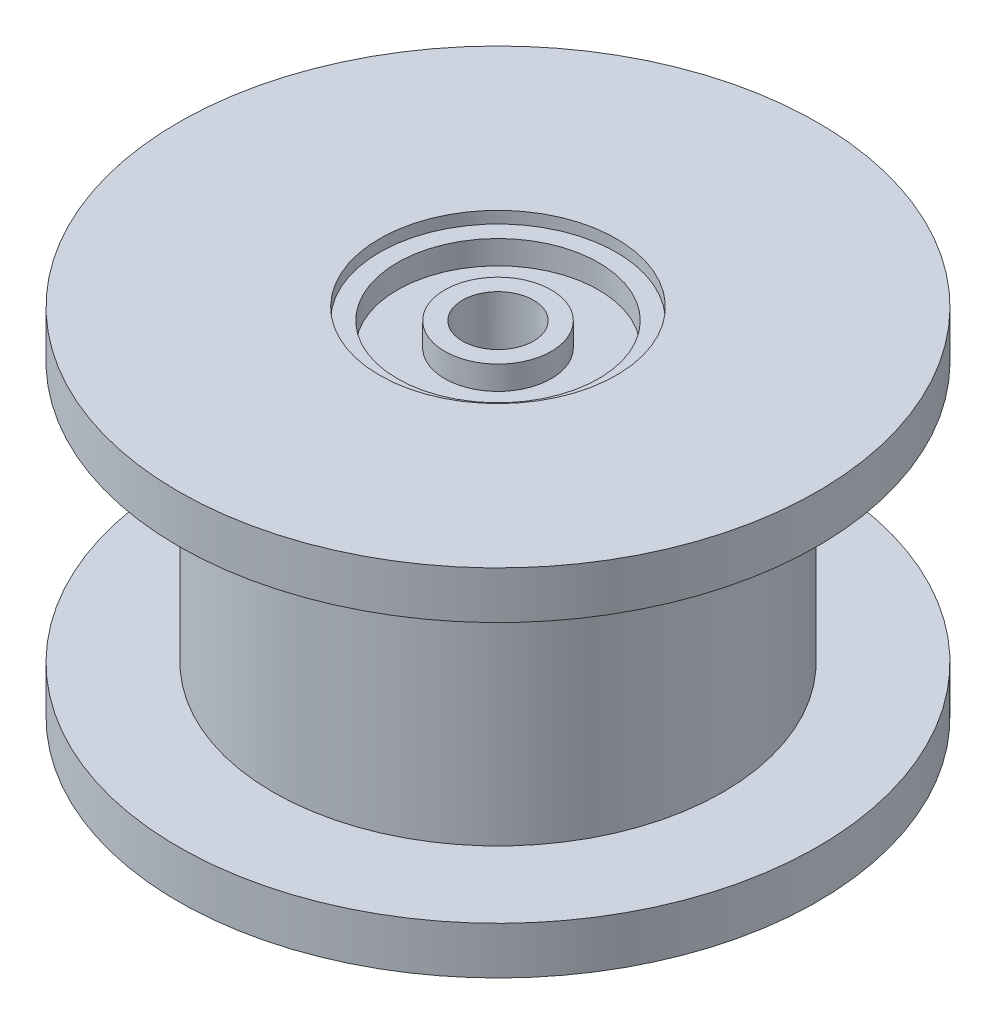
ISO-10303-21;
HEADER;
FILE_DESCRIPTION(('STEP AP214'),'2;1');
FILE_NAME('part.step','',(''),(''),'','','');
FILE_SCHEMA(('AUTOMOTIVE_DESIGN { 1 0 10303 214 1 1 1 1 }'));
ENDSEC;
DATA;
#1=APPLICATION_CONTEXT('core data for automotive mechanical design processes');
#2=APPLICATION_PROTOCOL_DEFINITION('international standard','automotive_design',2000,#1);
#3=PRODUCT_CONTEXT('',#1,'mechanical');
#4=PRODUCT('Part','Part','',(#3));
#5=PRODUCT_RELATED_PRODUCT_CATEGORY('part','',(#4));
#6=PRODUCT_DEFINITION_FORMATION('','',#4);
#7=PRODUCT_DEFINITION_CONTEXT('part definition',#1,'design');
#8=PRODUCT_DEFINITION('design','',#6,#7);
#9=PRODUCT_DEFINITION_SHAPE('','',#8);
#10=(LENGTH_UNIT() NAMED_UNIT(*) SI_UNIT(.MILLI.,.METRE.));
#11=(NAMED_UNIT(*) PLANE_ANGLE_UNIT() SI_UNIT($,.RADIAN.));
#12=(NAMED_UNIT(*) SI_UNIT($,.STERADIAN.) SOLID_ANGLE_UNIT());
#13=UNCERTAINTY_MEASURE_WITH_UNIT(LENGTH_MEASURE(1.E-05),#10,'distance_accuracy_value','');
#14=(GEOMETRIC_REPRESENTATION_CONTEXT(3) GLOBAL_UNCERTAINTY_ASSIGNED_CONTEXT((#13)) GLOBAL_UNIT_ASSIGNED_CONTEXT((#10,
#11,#12)) REPRESENTATION_CONTEXT('',''));
#15=CARTESIAN_POINT('',(0.,0.,0.));
#16=DIRECTION('',(0.,0.,1.));
#17=DIRECTION('',(1.,0.,0.));
#18=AXIS2_PLACEMENT_3D('',#15,#16,#17);
#19=CARTESIAN_POINT('',(0.,13.,0.));
#20=DIRECTION('',(0.,-1.,0.));
#21=DIRECTION('',(0.,0.,-1.));
#22=AXIS2_PLACEMENT_3D('',#19,#20,#21);
#23=CYLINDRICAL_SURFACE('',#22,1.5);
#24=CARTESIAN_POINT('',(0.,-1.5,0.));
#25=DIRECTION('',(0.,-1.,0.));
#26=DIRECTION('',(0.,0.,-1.));
#27=AXIS2_PLACEMENT_3D('',#24,#25,#26);
#28=CIRCLE('',#27,1.5);
#29=CARTESIAN_POINT('',(0.,-1.5,-1.5));
#30=VERTEX_POINT('',#29);
#31=EDGE_CURVE('E81',#30,#30,#28,.T.);
#32=ORIENTED_EDGE('',*,*,#31,.T.);
#33=EDGE_LOOP('',(#32));
#34=FACE_BOUND('',#33,.T.);
#35=CARTESIAN_POINT('',(0.,12.5,0.));
#36=DIRECTION('',(0.,1.,0.));
#37=DIRECTION('',(0.,0.,1.));
#38=AXIS2_PLACEMENT_3D('',#35,#36,#37);
#39=CIRCLE('',#38,1.5);
#40=CARTESIAN_POINT('',(0.,12.5,1.5));
#41=VERTEX_POINT('',#40);
#42=EDGE_CURVE('E102',#41,#41,#39,.F.);
#43=ORIENTED_EDGE('',*,*,#42,.F.);
#44=EDGE_LOOP('',(#43));
#45=FACE_BOUND('',#44,.T.);
#46=ADVANCED_FACE('F40',(#34,#45),#23,.F.);
#47=CARTESIAN_POINT('',(0.,11.5,0.));
#48=DIRECTION('',(0.,1.,0.));
#49=DIRECTION('',(0.,0.,1.));
#50=AXIS2_PLACEMENT_3D('',#47,#48,#49);
#51=CYLINDRICAL_SURFACE('',#50,2.25);
#52=CARTESIAN_POINT('',(0.,11.5,0.));
#53=DIRECTION('',(0.,1.,0.));
#54=DIRECTION('',(0.,0.,1.));
#55=AXIS2_PLACEMENT_3D('',#52,#53,#54);
#56=CIRCLE('',#55,2.25);
#57=CARTESIAN_POINT('',(0.,11.5,2.25));
#58=VERTEX_POINT('',#57);
#59=EDGE_CURVE('E96',#58,#58,#56,.T.);
#60=ORIENTED_EDGE('',*,*,#59,.T.);
#61=EDGE_LOOP('',(#60));
#62=FACE_BOUND('',#61,.T.);
#63=CARTESIAN_POINT('',(0.,12.5,0.));
#64=DIRECTION('',(0.,1.,0.));
#65=DIRECTION('',(0.,0.,1.));
#66=AXIS2_PLACEMENT_3D('',#63,#64,#65);
#67=CIRCLE('',#66,2.25);
#68=CARTESIAN_POINT('',(0.,12.5,2.25));
#69=VERTEX_POINT('',#68);
#70=EDGE_CURVE('E99',#69,#69,#67,.T.);
#71=ORIENTED_EDGE('',*,*,#70,.F.);
#72=EDGE_LOOP('',(#71));
#73=FACE_BOUND('',#72,.T.);
#74=ADVANCED_FACE('F110',(#62,#73),#51,.T.);
#75=CARTESIAN_POINT('',(0.,-0.5,0.));
#76=DIRECTION('',(0.,-1.,0.));
#77=DIRECTION('',(0.,0.,-1.));
#78=AXIS2_PLACEMENT_3D('',#75,#76,#77);
#79=CYLINDRICAL_SURFACE('',#78,2.25);
#80=CARTESIAN_POINT('',(0.,-0.5,0.));
#81=DIRECTION('',(0.,-1.,0.));
#82=DIRECTION('',(0.,0.,-1.));
#83=AXIS2_PLACEMENT_3D('',#80,#81,#82);
#84=CIRCLE('',#83,2.25);
#85=CARTESIAN_POINT('',(0.,-0.5,-2.25));
#86=VERTEX_POINT('',#85);
#87=EDGE_CURVE('E75',#86,#86,#84,.T.);
#88=ORIENTED_EDGE('',*,*,#87,.T.);
#89=EDGE_LOOP('',(#88));
#90=FACE_BOUND('',#89,.T.);
#91=CARTESIAN_POINT('',(0.,-1.5,0.));
#92=DIRECTION('',(0.,-1.,0.));
#93=DIRECTION('',(0.,0.,-1.));
#94=AXIS2_PLACEMENT_3D('',#91,#92,#93);
#95=CIRCLE('',#94,2.25);
#96=CARTESIAN_POINT('',(0.,-1.5,-2.25));
#97=VERTEX_POINT('',#96);
#98=EDGE_CURVE('E78',#97,#97,#95,.T.);
#99=ORIENTED_EDGE('',*,*,#98,.F.);
#100=EDGE_LOOP('',(#99));
#101=FACE_BOUND('',#100,.T.);
#102=ADVANCED_FACE('F116',(#90,#101),#79,.T.);
#103=CARTESIAN_POINT('',(0.,11.,0.));
#104=DIRECTION('',(0.,-1.,0.));
#105=DIRECTION('',(0.,0.,-1.));
#106=AXIS2_PLACEMENT_3D('',#103,#104,#105);
#107=CYLINDRICAL_SURFACE('',#106,9.5);
#108=CARTESIAN_POINT('',(0.,11.,0.));
#109=DIRECTION('',(0.,1.,0.));
#110=DIRECTION('',(0.,0.,1.));
#111=AXIS2_PLACEMENT_3D('',#108,#109,#110);
#112=CIRCLE('',#111,9.5);
#113=CARTESIAN_POINT('',(0.,11.,9.5));
#114=VERTEX_POINT('',#113);
#115=EDGE_CURVE('E11',#114,#114,#112,.T.);
#116=ORIENTED_EDGE('',*,*,#115,.F.);
#117=EDGE_LOOP('',(#116));
#118=FACE_BOUND('',#117,.T.);
#119=CARTESIAN_POINT('',(0.,0.,0.));
#120=DIRECTION('',(0.,1.,0.));
#121=DIRECTION('',(0.,0.,1.));
#122=AXIS2_PLACEMENT_3D('',#119,#120,#121);
#123=CIRCLE('',#122,9.5);
#124=CARTESIAN_POINT('',(0.,0.,9.5));
#125=VERTEX_POINT('',#124);
#126=EDGE_CURVE('E44',#125,#125,#123,.T.);
#127=ORIENTED_EDGE('',*,*,#126,.T.);
#128=EDGE_LOOP('',(#127));
#129=FACE_BOUND('',#128,.T.);
#130=ADVANCED_FACE('F42',(#118,#129),#107,.T.);
#131=CARTESIAN_POINT('',(0.,13.,0.));
#132=DIRECTION('',(0.,-1.,0.));
#133=DIRECTION('',(0.,0.,-1.));
#134=AXIS2_PLACEMENT_3D('',#131,#132,#133);
#135=CYLINDRICAL_SURFACE('',#134,13.5);
#136=CARTESIAN_POINT('',(0.,13.,0.));
#137=DIRECTION('',(0.,1.,0.));
#138=DIRECTION('',(0.,0.,1.));
#139=AXIS2_PLACEMENT_3D('',#136,#137,#138);
#140=CIRCLE('',#139,13.5);
#141=CARTESIAN_POINT('',(0.,13.,13.5));
#142=VERTEX_POINT('',#141);
#143=EDGE_CURVE('E48',#142,#142,#140,.T.);
#144=ORIENTED_EDGE('',*,*,#143,.F.);
#145=EDGE_LOOP('',(#144));
#146=FACE_BOUND('',#145,.T.);
#147=CARTESIAN_POINT('',(0.,11.,0.));
#148=DIRECTION('',(0.,1.,0.));
#149=DIRECTION('',(0.,0.,1.));
#150=AXIS2_PLACEMENT_3D('',#147,#148,#149);
#151=CIRCLE('',#150,13.5);
#152=CARTESIAN_POINT('',(0.,11.,13.5));
#153=VERTEX_POINT('',#152);
#154=EDGE_CURVE('E52',#153,#153,#151,.T.);
#155=ORIENTED_EDGE('',*,*,#154,.T.);
#156=EDGE_LOOP('',(#155));
#157=FACE_BOUND('',#156,.T.);
#158=ADVANCED_FACE('F162',(#146,#157),#135,.T.);
#159=CARTESIAN_POINT('',(0.,13.,0.));
#160=DIRECTION('',(0.,1.,0.));
#161=DIRECTION('',(0.,0.,1.));
#162=AXIS2_PLACEMENT_3D('',#159,#160,#161);
#163=PLANE('',#162);
#164=CARTESIAN_POINT('',(0.,13.,0.));
#165=DIRECTION('',(0.,1.,0.));
#166=DIRECTION('',(0.,0.,1.));
#167=AXIS2_PLACEMENT_3D('',#164,#165,#166);
#168=CIRCLE('',#167,5.);
#169=CARTESIAN_POINT('',(0.,13.,5.));
#170=VERTEX_POINT('',#169);
#171=EDGE_CURVE('E85',#170,#170,#168,.T.);
#172=ORIENTED_EDGE('',*,*,#171,.F.);
#173=EDGE_LOOP('',(#172));
#174=FACE_BOUND('',#173,.T.);
#175=ORIENTED_EDGE('',*,*,#143,.T.);
#176=EDGE_LOOP('',(#175));
#177=FACE_BOUND('',#176,.T.);
#178=ADVANCED_FACE('F159',(#174,#177),#163,.T.);
#179=CARTESIAN_POINT('',(0.,11.,0.));
#180=DIRECTION('',(0.,1.,0.));
#181=DIRECTION('',(0.,0.,1.));
#182=AXIS2_PLACEMENT_3D('',#179,#180,#181);
#183=PLANE('',#182);
#184=ORIENTED_EDGE('',*,*,#115,.T.);
#185=EDGE_LOOP('',(#184));
#186=FACE_BOUND('',#185,.T.);
#187=ORIENTED_EDGE('',*,*,#154,.F.);
#188=EDGE_LOOP('',(#187));
#189=FACE_BOUND('',#188,.T.);
#190=ADVANCED_FACE('F157',(#186,#189),#183,.F.);
#191=CARTESIAN_POINT('',(0.,-2.,0.));
#192=DIRECTION('',(0.,1.,0.));
#193=DIRECTION('',(0.,0.,1.));
#194=AXIS2_PLACEMENT_3D('',#191,#192,#193);
#195=CYLINDRICAL_SURFACE('',#194,13.5);
#196=CARTESIAN_POINT('',(0.,-2.,0.));
#197=DIRECTION('',(0.,-1.,0.));
#198=DIRECTION('',(0.,0.,-1.));
#199=AXIS2_PLACEMENT_3D('',#196,#197,#198);
#200=CIRCLE('',#199,13.5);
#201=CARTESIAN_POINT('',(0.,-2.,-13.5));
#202=VERTEX_POINT('',#201);
#203=EDGE_CURVE('E60',#202,#202,#200,.T.);
#204=ORIENTED_EDGE('',*,*,#203,.F.);
#205=EDGE_LOOP('',(#204));
#206=FACE_BOUND('',#205,.T.);
#207=CARTESIAN_POINT('',(0.,0.,0.));
#208=DIRECTION('',(0.,-1.,0.));
#209=DIRECTION('',(0.,0.,-1.));
#210=AXIS2_PLACEMENT_3D('',#207,#208,#209);
#211=CIRCLE('',#210,13.5);
#212=CARTESIAN_POINT('',(0.,0.,-13.5));
#213=VERTEX_POINT('',#212);
#214=EDGE_CURVE('E57',#213,#213,#211,.T.);
#215=ORIENTED_EDGE('',*,*,#214,.T.);
#216=EDGE_LOOP('',(#215));
#217=FACE_BOUND('',#216,.T.);
#218=ADVANCED_FACE('F150',(#206,#217),#195,.T.);
#219=CARTESIAN_POINT('',(0.,-2.,0.));
#220=DIRECTION('',(0.,-1.,0.));
#221=DIRECTION('',(0.,0.,-1.));
#222=AXIS2_PLACEMENT_3D('',#219,#220,#221);
#223=PLANE('',#222);
#224=CARTESIAN_POINT('',(0.,-2.,0.));
#225=DIRECTION('',(0.,-1.,0.));
#226=DIRECTION('',(0.,0.,-1.));
#227=AXIS2_PLACEMENT_3D('',#224,#225,#226);
#228=CIRCLE('',#227,5.);
#229=CARTESIAN_POINT('',(0.,-2.,-5.));
#230=VERTEX_POINT('',#229);
#231=EDGE_CURVE('E64',#230,#230,#228,.T.);
#232=ORIENTED_EDGE('',*,*,#231,.F.);
#233=EDGE_LOOP('',(#232));
#234=FACE_BOUND('',#233,.T.);
#235=ORIENTED_EDGE('',*,*,#203,.T.);
#236=EDGE_LOOP('',(#235));
#237=FACE_BOUND('',#236,.T.);
#238=ADVANCED_FACE('F147',(#234,#237),#223,.T.);
#239=CARTESIAN_POINT('',(0.,0.,0.));
#240=DIRECTION('',(0.,-1.,0.));
#241=DIRECTION('',(0.,0.,-1.));
#242=AXIS2_PLACEMENT_3D('',#239,#240,#241);
#243=PLANE('',#242);
#244=ORIENTED_EDGE('',*,*,#126,.F.);
#245=EDGE_LOOP('',(#244));
#246=FACE_BOUND('',#245,.T.);
#247=ORIENTED_EDGE('',*,*,#214,.F.);
#248=EDGE_LOOP('',(#247));
#249=FACE_BOUND('',#248,.T.);
#250=ADVANCED_FACE('F145',(#246,#249),#243,.F.);
#251=CARTESIAN_POINT('',(0.,-1.5,0.));
#252=DIRECTION('',(0.,-1.,0.));
#253=DIRECTION('',(0.,0.,-1.));
#254=AXIS2_PLACEMENT_3D('',#251,#252,#253);
#255=CYLINDRICAL_SURFACE('',#254,5.);
#256=CARTESIAN_POINT('',(0.,-1.5,0.));
#257=DIRECTION('',(0.,-1.,0.));
#258=DIRECTION('',(0.,0.,-1.));
#259=AXIS2_PLACEMENT_3D('',#256,#257,#258);
#260=CIRCLE('',#259,5.);
#261=CARTESIAN_POINT('',(0.,-1.5,-5.));
#262=VERTEX_POINT('',#261);
#263=EDGE_CURVE('E61',#262,#262,#260,.T.);
#264=ORIENTED_EDGE('',*,*,#263,.F.);
#265=EDGE_LOOP('',(#264));
#266=FACE_BOUND('',#265,.T.);
#267=ORIENTED_EDGE('',*,*,#231,.T.);
#268=EDGE_LOOP('',(#267));
#269=FACE_BOUND('',#268,.T.);
#270=ADVANCED_FACE('F141',(#266,#269),#255,.F.);
#271=CARTESIAN_POINT('',(0.,-1.5,0.));
#272=DIRECTION('',(0.,-1.,0.));
#273=DIRECTION('',(0.,0.,-1.));
#274=AXIS2_PLACEMENT_3D('',#271,#272,#273);
#275=PLANE('',#274);
#276=CARTESIAN_POINT('',(0.,-1.5,0.));
#277=DIRECTION('',(0.,-1.,0.));
#278=DIRECTION('',(0.,0.,-1.));
#279=AXIS2_PLACEMENT_3D('',#276,#277,#278);
#280=CIRCLE('',#279,4.25);
#281=CARTESIAN_POINT('',(0.,-1.5,-4.25));
#282=VERTEX_POINT('',#281);
#283=EDGE_CURVE('E67',#282,#282,#280,.T.);
#284=ORIENTED_EDGE('',*,*,#283,.F.);
#285=EDGE_LOOP('',(#284));
#286=FACE_BOUND('',#285,.T.);
#287=ORIENTED_EDGE('',*,*,#263,.T.);
#288=EDGE_LOOP('',(#287));
#289=FACE_BOUND('',#288,.T.);
#290=ADVANCED_FACE('F134',(#286,#289),#275,.T.);
#291=CARTESIAN_POINT('',(0.,-0.5,0.));
#292=DIRECTION('',(0.,-1.,0.));
#293=DIRECTION('',(0.,0.,-1.));
#294=AXIS2_PLACEMENT_3D('',#291,#292,#293);
#295=CYLINDRICAL_SURFACE('',#294,4.25);
#296=ORIENTED_EDGE('',*,*,#283,.T.);
#297=EDGE_LOOP('',(#296));
#298=FACE_BOUND('',#297,.T.);
#299=CARTESIAN_POINT('',(0.,-0.5,0.));
#300=DIRECTION('',(0.,-1.,0.));
#301=DIRECTION('',(0.,0.,-1.));
#302=AXIS2_PLACEMENT_3D('',#299,#300,#301);
#303=CIRCLE('',#302,4.25);
#304=CARTESIAN_POINT('',(0.,-0.5,-4.25));
#305=VERTEX_POINT('',#304);
#306=EDGE_CURVE('E72',#305,#305,#303,.T.);
#307=ORIENTED_EDGE('',*,*,#306,.F.);
#308=EDGE_LOOP('',(#307));
#309=FACE_BOUND('',#308,.T.);
#310=ADVANCED_FACE('F130',(#298,#309),#295,.F.);
#311=CARTESIAN_POINT('',(0.,-0.5,0.));
#312=DIRECTION('',(0.,-1.,0.));
#313=DIRECTION('',(0.,0.,-1.));
#314=AXIS2_PLACEMENT_3D('',#311,#312,#313);
#315=PLANE('',#314);
#316=ORIENTED_EDGE('',*,*,#87,.F.);
#317=EDGE_LOOP('',(#316));
#318=FACE_BOUND('',#317,.T.);
#319=ORIENTED_EDGE('',*,*,#306,.T.);
#320=EDGE_LOOP('',(#319));
#321=FACE_BOUND('',#320,.T.);
#322=ADVANCED_FACE('F126',(#318,#321),#315,.T.);
#323=CARTESIAN_POINT('',(0.,-1.5,0.));
#324=DIRECTION('',(0.,-1.,0.));
#325=DIRECTION('',(0.,0.,-1.));
#326=AXIS2_PLACEMENT_3D('',#323,#324,#325);
#327=PLANE('',#326);
#328=ORIENTED_EDGE('',*,*,#31,.F.);
#329=EDGE_LOOP('',(#328));
#330=FACE_BOUND('',#329,.T.);
#331=ORIENTED_EDGE('',*,*,#98,.T.);
#332=EDGE_LOOP('',(#331));
#333=FACE_BOUND('',#332,.T.);
#334=ADVANCED_FACE('F123',(#330,#333),#327,.T.);
#335=CARTESIAN_POINT('',(0.,12.5,0.));
#336=DIRECTION('',(0.,1.,0.));
#337=DIRECTION('',(0.,0.,1.));
#338=AXIS2_PLACEMENT_3D('',#335,#336,#337);
#339=CYLINDRICAL_SURFACE('',#338,5.);
#340=CARTESIAN_POINT('',(0.,12.5,0.));
#341=DIRECTION('',(0.,1.,0.));
#342=DIRECTION('',(0.,0.,1.));
#343=AXIS2_PLACEMENT_3D('',#340,#341,#342);
#344=CIRCLE('',#343,5.);
#345=CARTESIAN_POINT('',(0.,12.5,5.));
#346=VERTEX_POINT('',#345);
#347=EDGE_CURVE('E84',#346,#346,#344,.T.);
#348=ORIENTED_EDGE('',*,*,#347,.F.);
#349=EDGE_LOOP('',(#348));
#350=FACE_BOUND('',#349,.T.);
#351=ORIENTED_EDGE('',*,*,#171,.T.);
#352=EDGE_LOOP('',(#351));
#353=FACE_BOUND('',#352,.T.);
#354=ADVANCED_FACE('F121',(#350,#353),#339,.F.);
#355=CARTESIAN_POINT('',(0.,12.5,0.));
#356=DIRECTION('',(0.,1.,0.));
#357=DIRECTION('',(0.,0.,1.));
#358=AXIS2_PLACEMENT_3D('',#355,#356,#357);
#359=PLANE('',#358);
#360=CARTESIAN_POINT('',(0.,12.5,0.));
#361=DIRECTION('',(0.,1.,0.));
#362=DIRECTION('',(0.,0.,1.));
#363=AXIS2_PLACEMENT_3D('',#360,#361,#362);
#364=CIRCLE('',#363,4.25);
#365=CARTESIAN_POINT('',(0.,12.5,4.25));
#366=VERTEX_POINT('',#365);
#367=EDGE_CURVE('E88',#366,#366,#364,.T.);
#368=ORIENTED_EDGE('',*,*,#367,.F.);
#369=EDGE_LOOP('',(#368));
#370=FACE_BOUND('',#369,.T.);
#371=ORIENTED_EDGE('',*,*,#347,.T.);
#372=EDGE_LOOP('',(#371));
#373=FACE_BOUND('',#372,.T.);
#374=ADVANCED_FACE('F223',(#370,#373),#359,.T.);
#375=CARTESIAN_POINT('',(0.,11.5,0.));
#376=DIRECTION('',(0.,1.,0.));
#377=DIRECTION('',(0.,0.,1.));
#378=AXIS2_PLACEMENT_3D('',#375,#376,#377);
#379=CYLINDRICAL_SURFACE('',#378,4.25);
#380=ORIENTED_EDGE('',*,*,#367,.T.);
#381=EDGE_LOOP('',(#380));
#382=FACE_BOUND('',#381,.T.);
#383=CARTESIAN_POINT('',(0.,11.5,0.));
#384=DIRECTION('',(0.,1.,0.));
#385=DIRECTION('',(0.,0.,1.));
#386=AXIS2_PLACEMENT_3D('',#383,#384,#385);
#387=CIRCLE('',#386,4.25);
#388=CARTESIAN_POINT('',(0.,11.5,4.25));
#389=VERTEX_POINT('',#388);
#390=EDGE_CURVE('E93',#389,#389,#387,.T.);
#391=ORIENTED_EDGE('',*,*,#390,.F.);
#392=EDGE_LOOP('',(#391));
#393=FACE_BOUND('',#392,.T.);
#394=ADVANCED_FACE('F215',(#382,#393),#379,.F.);
#395=CARTESIAN_POINT('',(0.,11.5,0.));
#396=DIRECTION('',(0.,1.,0.));
#397=DIRECTION('',(0.,0.,1.));
#398=AXIS2_PLACEMENT_3D('',#395,#396,#397);
#399=PLANE('',#398);
#400=ORIENTED_EDGE('',*,*,#59,.F.);
#401=EDGE_LOOP('',(#400));
#402=FACE_BOUND('',#401,.T.);
#403=ORIENTED_EDGE('',*,*,#390,.T.);
#404=EDGE_LOOP('',(#403));
#405=FACE_BOUND('',#404,.T.);
#406=ADVANCED_FACE('F206',(#402,#405),#399,.T.);
#407=CARTESIAN_POINT('',(0.,12.5,0.));
#408=DIRECTION('',(0.,1.,0.));
#409=DIRECTION('',(0.,0.,1.));
#410=AXIS2_PLACEMENT_3D('',#407,#408,#409);
#411=PLANE('',#410);
#412=ORIENTED_EDGE('',*,*,#42,.T.);
#413=EDGE_LOOP('',(#412));
#414=FACE_BOUND('',#413,.T.);
#415=ORIENTED_EDGE('',*,*,#70,.T.);
#416=EDGE_LOOP('',(#415));
#417=FACE_BOUND('',#416,.T.);
#418=ADVANCED_FACE('F106',(#414,#417),#411,.T.);
#419=CLOSED_SHELL('',(#46,#74,#102,#130,#158,#178,#190,#218,#238,#250,#270,#290,#310,#322,#334,
#354,#374,#394,#406,#418));
#420=MANIFOLD_SOLID_BREP('B2',#419);
#421=ADVANCED_BREP_SHAPE_REPRESENTATION('',(#18,#420),#14);
#422=SHAPE_DEFINITION_REPRESENTATION(#9,#421);
ENDSEC;
END-ISO-10303-21;
